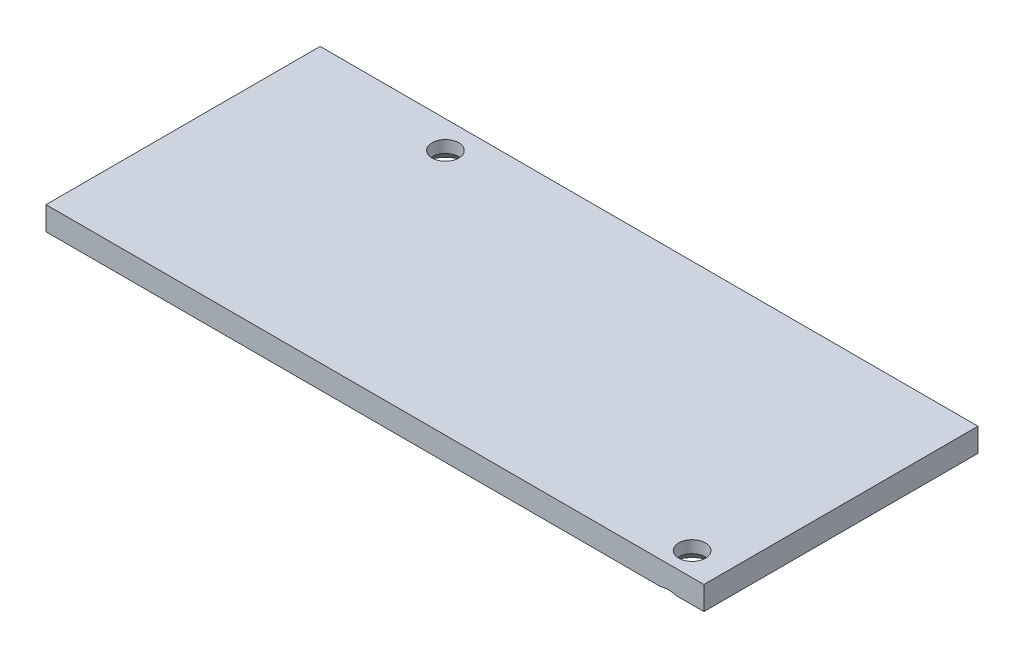
ISO-10303-21;
HEADER;
FILE_DESCRIPTION(('STEP AP214'),'2;1');
FILE_NAME('part.step','',(''),(''),'','','');
FILE_SCHEMA(('AUTOMOTIVE_DESIGN { 1 0 10303 214 1 1 1 1 }'));
ENDSEC;
DATA;
#1=APPLICATION_CONTEXT('core data for automotive mechanical design processes');
#2=APPLICATION_PROTOCOL_DEFINITION('international standard','automotive_design',2000,#1);
#3=PRODUCT_CONTEXT('',#1,'mechanical');
#4=PRODUCT('Part','Part','',(#3));
#5=PRODUCT_RELATED_PRODUCT_CATEGORY('part','',(#4));
#6=PRODUCT_DEFINITION_FORMATION('','',#4);
#7=PRODUCT_DEFINITION_CONTEXT('part definition',#1,'design');
#8=PRODUCT_DEFINITION('design','',#6,#7);
#9=PRODUCT_DEFINITION_SHAPE('','',#8);
#10=(LENGTH_UNIT() NAMED_UNIT(*) SI_UNIT(.MILLI.,.METRE.));
#11=(NAMED_UNIT(*) PLANE_ANGLE_UNIT() SI_UNIT($,.RADIAN.));
#12=(NAMED_UNIT(*) SI_UNIT($,.STERADIAN.) SOLID_ANGLE_UNIT());
#13=UNCERTAINTY_MEASURE_WITH_UNIT(LENGTH_MEASURE(1.E-05),#10,'distance_accuracy_value','');
#14=(GEOMETRIC_REPRESENTATION_CONTEXT(3) GLOBAL_UNCERTAINTY_ASSIGNED_CONTEXT((#13)) GLOBAL_UNIT_ASSIGNED_CONTEXT((#10,
#11,#12)) REPRESENTATION_CONTEXT('',''));
#15=CARTESIAN_POINT('',(0.,0.,0.));
#16=DIRECTION('',(0.,0.,1.));
#17=DIRECTION('',(1.,0.,0.));
#18=AXIS2_PLACEMENT_3D('',#15,#16,#17);
#19=CARTESIAN_POINT('',(42.,3.,17.5));
#20=DIRECTION('',(-1.,0.,0.));
#21=DIRECTION('',(0.,0.,1.));
#22=AXIS2_PLACEMENT_3D('',#19,#20,#21);
#23=PLANE('',#22);
#24=DIRECTION('',(0.,0.,-1.));
#25=VECTOR('',#24,1.);
#26=CARTESIAN_POINT('',(42.,0.,17.5));
#27=LINE('',#26,#25);
#28=CARTESIAN_POINT('',(42.,0.,17.5));
#29=VERTEX_POINT('',#28);
#30=CARTESIAN_POINT('',(42.,0.,-17.5));
#31=VERTEX_POINT('',#30);
#32=EDGE_CURVE('E98',#29,#31,#27,.T.);
#33=ORIENTED_EDGE('',*,*,#32,.T.);
#34=DIRECTION('',(0.,-1.,0.));
#35=VECTOR('',#34,1.);
#36=CARTESIAN_POINT('',(42.,3.,-17.5));
#37=LINE('',#36,#35);
#38=CARTESIAN_POINT('',(42.,3.,-17.5));
#39=VERTEX_POINT('',#38);
#40=EDGE_CURVE('E40',#39,#31,#37,.T.);
#41=ORIENTED_EDGE('',*,*,#40,.F.);
#42=DIRECTION('',(0.,0.,-1.));
#43=VECTOR('',#42,1.);
#44=CARTESIAN_POINT('',(42.,3.,17.5));
#45=LINE('',#44,#43);
#46=CARTESIAN_POINT('',(42.,3.,17.5));
#47=VERTEX_POINT('',#46);
#48=EDGE_CURVE('E101',#47,#39,#45,.T.);
#49=ORIENTED_EDGE('',*,*,#48,.F.);
#50=DIRECTION('',(0.,-1.,0.));
#51=VECTOR('',#50,1.);
#52=CARTESIAN_POINT('',(42.,3.,17.5));
#53=LINE('',#52,#51);
#54=EDGE_CURVE('E106',#47,#29,#53,.T.);
#55=ORIENTED_EDGE('',*,*,#54,.T.);
#56=EDGE_LOOP('',(#33,#41,#49,#55));
#57=FACE_BOUND('',#56,.T.);
#58=ADVANCED_FACE('F33',(#57),#23,.F.);
#59=CARTESIAN_POINT('',(-42.,3.,-17.5));
#60=DIRECTION('',(0.,0.,1.));
#61=DIRECTION('',(1.,0.,0.));
#62=AXIS2_PLACEMENT_3D('',#59,#60,#61);
#63=PLANE('',#62);
#64=DIRECTION('',(-1.,0.,0.));
#65=VECTOR('',#64,1.);
#66=CARTESIAN_POINT('',(-42.,0.,-17.5));
#67=LINE('',#66,#65);
#68=CARTESIAN_POINT('',(-42.,0.,-17.5));
#69=VERTEX_POINT('',#68);
#70=EDGE_CURVE('E102',#31,#69,#67,.T.);
#71=ORIENTED_EDGE('',*,*,#70,.T.);
#72=DIRECTION('',(0.,-1.,0.));
#73=VECTOR('',#72,1.);
#74=CARTESIAN_POINT('',(-42.,3.,-17.5));
#75=LINE('',#74,#73);
#76=CARTESIAN_POINT('',(-42.,3.,-17.5));
#77=VERTEX_POINT('',#76);
#78=EDGE_CURVE('E110',#77,#69,#75,.T.);
#79=ORIENTED_EDGE('',*,*,#78,.F.);
#80=DIRECTION('',(-1.,0.,0.));
#81=VECTOR('',#80,1.);
#82=CARTESIAN_POINT('',(-42.,3.,-17.5));
#83=LINE('',#82,#81);
#84=EDGE_CURVE('E82',#39,#77,#83,.T.);
#85=ORIENTED_EDGE('',*,*,#84,.F.);
#86=ORIENTED_EDGE('',*,*,#40,.T.);
#87=EDGE_LOOP('',(#71,#79,#85,#86));
#88=FACE_BOUND('',#87,.T.);
#89=ADVANCED_FACE('F113',(#88),#63,.F.);
#90=CARTESIAN_POINT('',(-42.,3.,17.5));
#91=DIRECTION('',(1.,0.,0.));
#92=DIRECTION('',(0.,0.,-1.));
#93=AXIS2_PLACEMENT_3D('',#90,#91,#92);
#94=PLANE('',#93);
#95=DIRECTION('',(0.,0.,1.));
#96=VECTOR('',#95,1.);
#97=CARTESIAN_POINT('',(-42.,0.,17.5));
#98=LINE('',#97,#96);
#99=CARTESIAN_POINT('',(-42.,0.,17.5));
#100=VERTEX_POINT('',#99);
#101=EDGE_CURVE('E99',#69,#100,#98,.T.);
#102=ORIENTED_EDGE('',*,*,#101,.T.);
#103=DIRECTION('',(0.,-1.,0.));
#104=VECTOR('',#103,1.);
#105=CARTESIAN_POINT('',(-42.,3.,17.5));
#106=LINE('',#105,#104);
#107=CARTESIAN_POINT('',(-42.,3.,17.5));
#108=VERTEX_POINT('',#107);
#109=EDGE_CURVE('E108',#108,#100,#106,.T.);
#110=ORIENTED_EDGE('',*,*,#109,.F.);
#111=DIRECTION('',(0.,0.,1.));
#112=VECTOR('',#111,1.);
#113=CARTESIAN_POINT('',(-42.,3.,17.5));
#114=LINE('',#113,#112);
#115=EDGE_CURVE('E123',#77,#108,#114,.T.);
#116=ORIENTED_EDGE('',*,*,#115,.F.);
#117=ORIENTED_EDGE('',*,*,#78,.T.);
#118=EDGE_LOOP('',(#102,#110,#116,#117));
#119=FACE_BOUND('',#118,.T.);
#120=ADVANCED_FACE('F167',(#119),#94,.F.);
#121=CARTESIAN_POINT('',(-42.,3.,17.5));
#122=DIRECTION('',(0.,0.,-1.));
#123=DIRECTION('',(-1.,0.,0.));
#124=AXIS2_PLACEMENT_3D('',#121,#122,#123);
#125=PLANE('',#124);
#126=DIRECTION('',(1.,0.,0.));
#127=VECTOR('',#126,1.);
#128=CARTESIAN_POINT('',(-42.,0.,17.5));
#129=LINE('',#128,#127);
#130=CARTESIAN_POINT('',(36.5395313643851,0.,17.5));
#131=VERTEX_POINT('',#130);
#132=EDGE_CURVE('E90',#100,#131,#129,.T.);
#133=ORIENTED_EDGE('',*,*,#132,.T.);
#134=CARTESIAN_POINT('',(28.1229577603597,-6.69524865932793,17.5));
#135=CARTESIAN_POINT('',(28.3443814169418,-6.48437405867633,17.5));
#136=CARTESIAN_POINT('',(28.5661342152509,-6.27384335836733,17.5));
#137=CARTESIAN_POINT('',(29.010504479636,-5.85367734179131,17.5));
#138=CARTESIAN_POINT('',(29.2331219829492,-5.64404206491915,17.5));
#139=CARTESIAN_POINT('',(29.6799654454608,-5.22537132417329,17.5));
#140=CARTESIAN_POINT('',(29.9041940317644,-5.01633866118001,17.5));
#141=CARTESIAN_POINT('',(30.3539881536903,-4.59972845592245,17.5));
#142=CARTESIAN_POINT('',(30.5795536515148,-4.39215087287827,17.5));
#143=CARTESIAN_POINT('',(31.0585350440747,-3.95505197280306,17.5));
#144=CARTESIAN_POINT('',(31.3121621112776,-3.72576148238486,17.5));
#145=CARTESIAN_POINT('',(31.822378678116,-3.27044558114069,17.5));
#146=CARTESIAN_POINT('',(32.0789684580493,-3.04442048387875,17.5));
#147=CARTESIAN_POINT('',(32.5958985208925,-2.59745425606828,17.5));
#148=CARTESIAN_POINT('',(32.8562326129003,-2.37650602000077,17.5));
#149=CARTESIAN_POINT('',(33.2512614496473,-2.05060765266719,17.5));
#150=CARTESIAN_POINT('',(33.3836821257064,-1.94290349070517,17.5));
#151=CARTESIAN_POINT('',(33.6504016185555,-1.72985048176004,17.5));
#152=CARTESIAN_POINT('',(33.7847003444583,-1.62450152143498,17.5));
#153=CARTESIAN_POINT('',(34.0233793492513,-1.44156921784115,17.5));
#154=CARTESIAN_POINT('',(34.1272695246124,-1.36334733253796,17.5));
#155=CARTESIAN_POINT('',(34.3366684412711,-1.20908789758964,17.5));
#156=CARTESIAN_POINT('',(34.4421772307181,-1.13305041311836,17.5));
#157=CARTESIAN_POINT('',(34.6553484455183,-0.983552410822028,17.5));
#158=CARTESIAN_POINT('',(34.7630149675315,-0.91009770666327,17.5));
#159=CARTESIAN_POINT('',(34.9806496823334,-0.766684935024379,17.5));
#160=CARTESIAN_POINT('',(35.0906177569918,-0.696726688705243,17.5));
#161=CARTESIAN_POINT('',(35.310710038576,-0.562888488832406,17.5));
#162=CARTESIAN_POINT('',(35.4207698798141,-0.498904347290031,17.5));
#163=CARTESIAN_POINT('',(35.6439284305768,-0.376511973735199,17.5));
#164=CARTESIAN_POINT('',(35.7570279952647,-0.318105332330479,17.5));
#165=CARTESIAN_POINT('',(36.1008332127324,-0.154116818996296,17.5));
#166=CARTESIAN_POINT('',(36.3371126947326,-0.0590805281472382,17.5));
#167=CARTESIAN_POINT('',(36.6547755090427,0.0340171502413189,17.5));
#168=CARTESIAN_POINT('',(36.7299367279961,0.0536224948613373,17.5));
#169=CARTESIAN_POINT('',(36.8814291757471,0.0877815083657414,17.5));
#170=CARTESIAN_POINT('',(36.9577605732101,0.10233444172738,17.5));
#171=CARTESIAN_POINT('',(37.1111096655056,0.125845190158967,17.5));
#172=CARTESIAN_POINT('',(37.1881253935999,0.134815714118937,17.5));
#173=CARTESIAN_POINT('',(37.3426165237877,0.146861999054321,17.5));
#174=CARTESIAN_POINT('',(37.4200919086082,0.149937980146949,17.5));
#175=CARTESIAN_POINT('',(37.5895530686723,0.150071478553271,17.5));
#176=CARTESIAN_POINT('',(37.6815422960483,0.145895605508241,17.5));
#177=CARTESIAN_POINT('',(37.864768978408,0.129284396719827,17.5));
#178=CARTESIAN_POINT('',(37.9560063115852,0.116847748364735,17.5));
#179=CARTESIAN_POINT('',(38.1374687877915,0.0843255110667135,17.5));
#180=CARTESIAN_POINT('',(38.2276883910731,0.0642093903155137,17.5));
#181=CARTESIAN_POINT('',(38.4063379892683,0.0172664913400145,17.5));
#182=CARTESIAN_POINT('',(38.4947678629254,-0.00956073993681864,17.5));
#183=CARTESIAN_POINT('',(38.771596470602,-0.103484424049908,17.5));
#184=CARTESIAN_POINT('',(38.9564545812771,-0.181087052486862,17.5));
#185=CARTESIAN_POINT('',(39.2272033847921,-0.310774826685487,17.5));
#186=CARTESIAN_POINT('',(39.3164576219841,-0.356275321429622,17.5));
#187=CARTESIAN_POINT('',(39.4930210235354,-0.450913120648055,17.5));
#188=CARTESIAN_POINT('',(39.5803304902449,-0.500049854595463,17.5));
#189=CARTESIAN_POINT('',(39.754428932168,-0.601986236441941,17.5));
#190=CARTESIAN_POINT('',(39.8411930837361,-0.654827859097276,17.5));
#191=CARTESIAN_POINT('',(40.0131601536382,-0.762992127943723,17.5));
#192=CARTESIAN_POINT('',(40.0983630347846,-0.818314833123005,17.5));
#193=CARTESIAN_POINT('',(40.2673250839585,-0.930946560747128,17.5));
#194=CARTESIAN_POINT('',(40.3510855363781,-0.988253662956385,17.5));
#195=CARTESIAN_POINT('',(40.5174155809991,-1.10455905742247,17.5));
#196=CARTESIAN_POINT('',(40.5999852208848,-1.16355728167658,17.5));
#197=CARTESIAN_POINT('',(40.8720985214965,-1.36153651934652,17.5));
#198=CARTESIAN_POINT('',(41.0594077750178,-1.5035892476185,17.5));
#199=CARTESIAN_POINT('',(41.430019974709,-1.79284384093278,17.5));
#200=CARTESIAN_POINT('',(41.6133221911731,-1.9400466313477,17.5));
#201=CARTESIAN_POINT('',(41.9770036097753,-2.23820214277596,17.5));
#202=CARTESIAN_POINT('',(42.157381230304,-2.38915678789534,17.5));
#203=CARTESIAN_POINT('',(42.5158361076454,-2.69377489359557,17.5));
#204=CARTESIAN_POINT('',(42.6939132945913,-2.84743843611508,17.5));
#205=CARTESIAN_POINT('',(43.0487043521542,-3.15718808699263,17.5));
#206=CARTESIAN_POINT('',(43.2254138862186,-3.31327915384512,17.5));
#207=CARTESIAN_POINT('',(43.5774088573119,-3.62706165429955,17.5));
#208=CARTESIAN_POINT('',(43.7526942722738,-3.78475311261509,17.5));
#209=CARTESIAN_POINT('',(44.276733803915,-4.25959719419656,17.5));
#210=CARTESIAN_POINT('',(44.6237893284713,-4.57862351712411,17.5));
#211=CARTESIAN_POINT('',(45.2731237715882,-5.18119390945376,17.5));
#212=CARTESIAN_POINT('',(45.5757469718862,-5.46436850505159,17.5));
#213=CARTESIAN_POINT('',(46.1792937482193,-6.03258037734859,17.5));
#214=CARTESIAN_POINT('',(46.4802171585353,-6.31761783001491,17.5));
#215=CARTESIAN_POINT('',(47.0794298779472,-6.88777881070597,17.5));
#216=CARTESIAN_POINT('',(47.3777249493922,-7.17289629060049,17.5));
#217=CARTESIAN_POINT('',(47.9732727882742,-7.74415130939826,17.5));
#218=CARTESIAN_POINT('',(48.2705256689521,-8.03028873020633,17.5));
#219=CARTESIAN_POINT('',(48.5674117342843,-8.3168043715838,17.5));
#220=B_SPLINE_CURVE_WITH_KNOTS('',3,(#134,#135,#136,#137,#138,#139,#140,#141,#142,#143,#144,
#145,#146,#147,#148,#149,#150,#151,#152,#153,#154,#155,#156,#157,#158,#159,#160,#161,#162,#163,
#164,#165,#166,#167,#168,#169,#170,#171,#172,#173,#174,#175,#176,#177,#178,#179,#180,#181,#182,
#183,#184,#185,#186,#187,#188,#189,#190,#191,#192,#193,#194,#195,#196,#197,#198,#199,#200,#201,
#202,#203,#204,#205,#206,#207,#208,#209,#210,#211,#212,#213,#214,#215,#216,#217,#218,#219),
.UNSPECIFIED.,.F.,.F.,(4,2,2,2,2,2,2,2,2,2,2,2,2,2,2,2,2,2,2,2,2,2,2,2,2,2,2,2,2,2,2,2,2,2,2,2,
2,2,2,2,2,2,4),(0.,0.917317453447056,1.83467485767191,2.75432071309028,3.6739406907439,
4.69964192959057,5.72544101681109,6.74970416971815,7.2617580465501,7.77378722797549,
8.16390113643708,8.55402667228676,8.94498045209635,9.33591421465107,9.71766347823612,
10.0995212870838,10.8594445932228,11.0923355516866,11.3252603998776,11.5576530135744,
11.7900369489711,12.0658887920993,12.341784477723,12.61878868101,12.8958115892993,
13.495527295027,13.796045585967,14.0965168250724,14.4012374587045,14.7059653409674,
15.010406164705,15.3148347635171,16.0199286173674,16.725149821094,17.4307404745864,
18.1363525075136,18.8436703568315,19.5509991453802,20.9651846462967,22.2085265519686,
23.4519876531173,24.6899055754288,25.9276845402325),.UNSPECIFIED.);
#221=CARTESIAN_POINT('',(38.4604686356149,0.,17.5));
#222=VERTEX_POINT('',#221);
#223=EDGE_CURVE('E45',#131,#222,#220,.T.);
#224=ORIENTED_EDGE('',*,*,#223,.T.);
#225=EDGE_CURVE('E74',#222,#29,#129,.T.);
#226=ORIENTED_EDGE('',*,*,#225,.T.);
#227=ORIENTED_EDGE('',*,*,#54,.F.);
#228=DIRECTION('',(1.,0.,0.));
#229=VECTOR('',#228,1.);
#230=CARTESIAN_POINT('',(-42.,3.,17.5));
#231=LINE('',#230,#229);
#232=EDGE_CURVE('E54',#108,#47,#231,.T.);
#233=ORIENTED_EDGE('',*,*,#232,.F.);
#234=ORIENTED_EDGE('',*,*,#109,.T.);
#235=EDGE_LOOP('',(#133,#224,#226,#227,#233,#234));
#236=FACE_BOUND('',#235,.T.);
#237=ADVANCED_FACE('F88',(#236),#125,.F.);
#238=CARTESIAN_POINT('',(0.,3.,0.));
#239=DIRECTION('',(0.,-1.,0.));
#240=DIRECTION('',(0.,0.,-1.));
#241=AXIS2_PLACEMENT_3D('',#238,#239,#240);
#242=PLANE('',#241);
#243=CARTESIAN_POINT('',(37.5,3.,14.5));
#244=DIRECTION('',(0.,-1.,0.));
#245=DIRECTION('',(0.,0.,-1.));
#246=AXIS2_PLACEMENT_3D('',#243,#244,#245);
#247=CIRCLE('',#246,1.7);
#248=CARTESIAN_POINT('',(37.5,3.,12.8));
#249=VERTEX_POINT('',#248);
#250=EDGE_CURVE('E92',#249,#249,#247,.T.);
#251=ORIENTED_EDGE('',*,*,#250,.T.);
#252=EDGE_LOOP('',(#251));
#253=FACE_BOUND('',#252,.T.);
#254=CARTESIAN_POINT('',(-22.5,3.,-14.));
#255=DIRECTION('',(0.,-1.,0.));
#256=DIRECTION('',(0.,0.,-1.));
#257=AXIS2_PLACEMENT_3D('',#254,#255,#256);
#258=CIRCLE('',#257,1.7);
#259=CARTESIAN_POINT('',(-22.5,3.,-15.7));
#260=VERTEX_POINT('',#259);
#261=EDGE_CURVE('E116',#260,#260,#258,.T.);
#262=ORIENTED_EDGE('',*,*,#261,.T.);
#263=EDGE_LOOP('',(#262));
#264=FACE_BOUND('',#263,.T.);
#265=ORIENTED_EDGE('',*,*,#48,.T.);
#266=ORIENTED_EDGE('',*,*,#84,.T.);
#267=ORIENTED_EDGE('',*,*,#115,.T.);
#268=ORIENTED_EDGE('',*,*,#232,.T.);
#269=EDGE_LOOP('',(#265,#266,#267,#268));
#270=FACE_BOUND('',#269,.T.);
#271=ADVANCED_FACE('F157',(#253,#264,#270),#242,.F.);
#272=CARTESIAN_POINT('',(0.,0.,0.));
#273=DIRECTION('',(0.,-1.,0.));
#274=DIRECTION('',(0.,0.,-1.));
#275=AXIS2_PLACEMENT_3D('',#272,#273,#274);
#276=PLANE('',#275);
#277=CARTESIAN_POINT('',(37.5,0.,14.5));
#278=DIRECTION('',(0.,-1.,0.));
#279=DIRECTION('',(0.,0.,-1.));
#280=AXIS2_PLACEMENT_3D('',#277,#278,#279);
#281=CIRCLE('',#280,3.15);
#282=EDGE_CURVE('E11',#131,#222,#281,.T.);
#283=ORIENTED_EDGE('',*,*,#282,.F.);
#284=ORIENTED_EDGE('',*,*,#132,.F.);
#285=ORIENTED_EDGE('',*,*,#101,.F.);
#286=ORIENTED_EDGE('',*,*,#70,.F.);
#287=ORIENTED_EDGE('',*,*,#32,.F.);
#288=ORIENTED_EDGE('',*,*,#225,.F.);
#289=EDGE_LOOP('',(#283,#284,#285,#286,#287,#288));
#290=FACE_BOUND('',#289,.T.);
#291=CARTESIAN_POINT('',(-22.5,0.,-14.));
#292=DIRECTION('',(0.,-1.,0.));
#293=DIRECTION('',(0.,0.,-1.));
#294=AXIS2_PLACEMENT_3D('',#291,#292,#293);
#295=CIRCLE('',#294,3.15);
#296=CARTESIAN_POINT('',(-22.5,0.,-17.15));
#297=VERTEX_POINT('',#296);
#298=EDGE_CURVE('E91',#297,#297,#295,.T.);
#299=ORIENTED_EDGE('',*,*,#298,.F.);
#300=EDGE_LOOP('',(#299));
#301=FACE_BOUND('',#300,.T.);
#302=ADVANCED_FACE('F95',(#290,#301),#276,.T.);
#303=CARTESIAN_POINT('',(-22.5,0.,-14.));
#304=DIRECTION('',(0.,-1.,0.));
#305=DIRECTION('',(0.,0.,-1.));
#306=AXIS2_PLACEMENT_3D('',#303,#304,#305);
#307=CYLINDRICAL_SURFACE('',#306,1.7);
#308=ORIENTED_EDGE('',*,*,#261,.F.);
#309=EDGE_LOOP('',(#308));
#310=FACE_BOUND('',#309,.T.);
#311=CARTESIAN_POINT('',(-22.5,1.45,-14.));
#312=DIRECTION('',(0.,-1.,0.));
#313=DIRECTION('',(0.,0.,-1.));
#314=AXIS2_PLACEMENT_3D('',#311,#312,#313);
#315=CIRCLE('',#314,1.7);
#316=CARTESIAN_POINT('',(-22.5,1.45,-15.7));
#317=VERTEX_POINT('',#316);
#318=EDGE_CURVE('E119',#317,#317,#315,.T.);
#319=ORIENTED_EDGE('',*,*,#318,.T.);
#320=EDGE_LOOP('',(#319));
#321=FACE_BOUND('',#320,.T.);
#322=ADVANCED_FACE('F152',(#310,#321),#307,.F.);
#323=CARTESIAN_POINT('',(-22.5,0.,-14.));
#324=DIRECTION('',(0.,-1.,0.));
#325=DIRECTION('',(0.,0.,-1.));
#326=AXIS2_PLACEMENT_3D('',#323,#324,#325);
#327=CONICAL_SURFACE('',#326,3.15,0.785398163397449);
#328=ORIENTED_EDGE('',*,*,#318,.F.);
#329=EDGE_LOOP('',(#328));
#330=FACE_BOUND('',#329,.T.);
#331=ORIENTED_EDGE('',*,*,#298,.T.);
#332=EDGE_LOOP('',(#331));
#333=FACE_BOUND('',#332,.T.);
#334=ADVANCED_FACE('F145',(#330,#333),#327,.F.);
#335=CARTESIAN_POINT('',(37.5,0.,14.5));
#336=DIRECTION('',(0.,-1.,0.));
#337=DIRECTION('',(0.,0.,-1.));
#338=AXIS2_PLACEMENT_3D('',#335,#336,#337);
#339=CONICAL_SURFACE('',#338,3.15,0.785398163397449);
#340=CARTESIAN_POINT('',(37.5,1.45,14.5));
#341=DIRECTION('',(0.,-1.,0.));
#342=DIRECTION('',(0.,0.,-1.));
#343=AXIS2_PLACEMENT_3D('',#340,#341,#342);
#344=CIRCLE('',#343,1.7);
#345=CARTESIAN_POINT('',(37.5,1.45,12.8));
#346=VERTEX_POINT('',#345);
#347=EDGE_CURVE('E238',#346,#346,#344,.T.);
#348=ORIENTED_EDGE('',*,*,#347,.F.);
#349=EDGE_LOOP('',(#348));
#350=FACE_BOUND('',#349,.T.);
#351=ORIENTED_EDGE('',*,*,#282,.T.);
#352=ORIENTED_EDGE('',*,*,#223,.F.);
#353=EDGE_LOOP('',(#351,#352));
#354=FACE_BOUND('',#353,.T.);
#355=ADVANCED_FACE('F84',(#350,#354),#339,.F.);
#356=CARTESIAN_POINT('',(37.5,0.,14.5));
#357=DIRECTION('',(0.,-1.,0.));
#358=DIRECTION('',(0.,0.,-1.));
#359=AXIS2_PLACEMENT_3D('',#356,#357,#358);
#360=CYLINDRICAL_SURFACE('',#359,1.7);
#361=ORIENTED_EDGE('',*,*,#250,.F.);
#362=EDGE_LOOP('',(#361));
#363=FACE_BOUND('',#362,.T.);
#364=ORIENTED_EDGE('',*,*,#347,.T.);
#365=EDGE_LOOP('',(#364));
#366=FACE_BOUND('',#365,.T.);
#367=ADVANCED_FACE('F144',(#363,#366),#360,.F.);
#368=CLOSED_SHELL('',(#58,#89,#120,#237,#271,#302,#322,#334,#355,#367));
#369=MANIFOLD_SOLID_BREP('B2',#368);
#370=ADVANCED_BREP_SHAPE_REPRESENTATION('',(#18,#369),#14);
#371=SHAPE_DEFINITION_REPRESENTATION(#9,#370);
ENDSEC;
END-ISO-10303-21;
